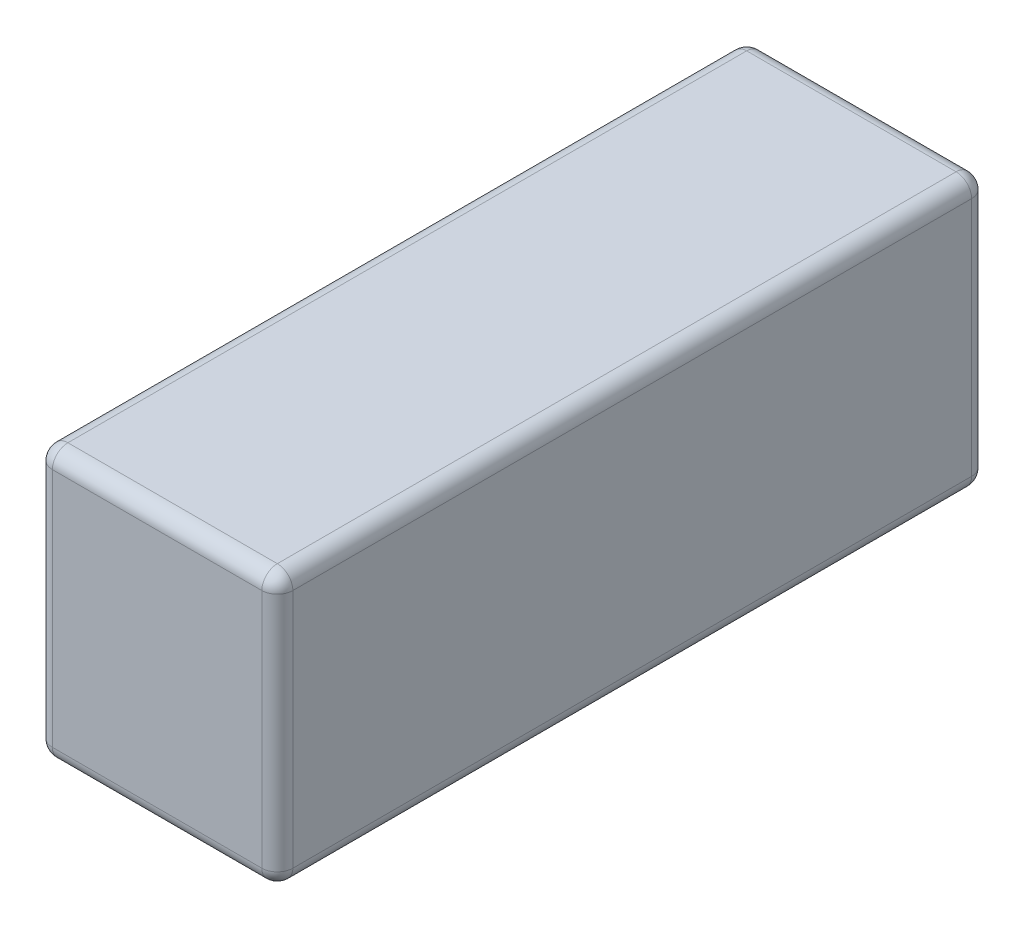
ISO-10303-21;
HEADER;
FILE_DESCRIPTION(('STEP AP214'),'2;1');
FILE_NAME('part.step','',(''),(''),'','','');
FILE_SCHEMA(('AUTOMOTIVE_DESIGN { 1 0 10303 214 1 1 1 1 }'));
ENDSEC;
DATA;
#1=APPLICATION_CONTEXT('core data for automotive mechanical design processes');
#2=APPLICATION_PROTOCOL_DEFINITION('international standard','automotive_design',2000,#1);
#3=PRODUCT_CONTEXT('',#1,'mechanical');
#4=PRODUCT('Part','Part','',(#3));
#5=PRODUCT_RELATED_PRODUCT_CATEGORY('part','',(#4));
#6=PRODUCT_DEFINITION_FORMATION('','',#4);
#7=PRODUCT_DEFINITION_CONTEXT('part definition',#1,'design');
#8=PRODUCT_DEFINITION('design','',#6,#7);
#9=PRODUCT_DEFINITION_SHAPE('','',#8);
#10=(LENGTH_UNIT() NAMED_UNIT(*) SI_UNIT(.MILLI.,.METRE.));
#11=(NAMED_UNIT(*) PLANE_ANGLE_UNIT() SI_UNIT($,.RADIAN.));
#12=(NAMED_UNIT(*) SI_UNIT($,.STERADIAN.) SOLID_ANGLE_UNIT());
#13=UNCERTAINTY_MEASURE_WITH_UNIT(LENGTH_MEASURE(1.E-05),#10,'distance_accuracy_value','');
#14=(GEOMETRIC_REPRESENTATION_CONTEXT(3) GLOBAL_UNCERTAINTY_ASSIGNED_CONTEXT((#13)) GLOBAL_UNIT_ASSIGNED_CONTEXT((#10,
#11,#12)) REPRESENTATION_CONTEXT('',''));
#15=CARTESIAN_POINT('',(0.,0.,0.));
#16=DIRECTION('',(0.,0.,1.));
#17=DIRECTION('',(1.,0.,0.));
#18=AXIS2_PLACEMENT_3D('',#15,#16,#17);
#19=CARTESIAN_POINT('',(15.5,17.5,91.5));
#20=DIRECTION('',(-1.,0.,0.));
#21=DIRECTION('',(0.,-1.,0.));
#22=AXIS2_PLACEMENT_3D('',#19,#20,#21);
#23=PLANE('',#22);
#24=DIRECTION('',(0.,0.,-1.));
#25=VECTOR('',#24,1.);
#26=CARTESIAN_POINT('',(15.5,15.5,91.5));
#27=LINE('',#26,#25);
#28=CARTESIAN_POINT('',(15.5,15.5,2.));
#29=VERTEX_POINT('',#28);
#30=CARTESIAN_POINT('',(15.5,15.5,89.5));
#31=VERTEX_POINT('',#30);
#32=EDGE_CURVE('E209',#29,#31,#27,.F.);
#33=ORIENTED_EDGE('',*,*,#32,.T.);
#34=DIRECTION('',(0.,1.,0.));
#35=VECTOR('',#34,1.);
#36=CARTESIAN_POINT('',(15.5,-17.5,89.5));
#37=LINE('',#36,#35);
#38=CARTESIAN_POINT('',(15.5,-15.5,89.5));
#39=VERTEX_POINT('',#38);
#40=EDGE_CURVE('E218',#31,#39,#37,.F.);
#41=ORIENTED_EDGE('',*,*,#40,.T.);
#42=DIRECTION('',(0.,0.,-1.));
#43=VECTOR('',#42,1.);
#44=CARTESIAN_POINT('',(15.5,-15.5,91.5));
#45=LINE('',#44,#43);
#46=CARTESIAN_POINT('',(15.5,-15.5,2.));
#47=VERTEX_POINT('',#46);
#48=EDGE_CURVE('E215',#39,#47,#45,.T.);
#49=ORIENTED_EDGE('',*,*,#48,.T.);
#50=DIRECTION('',(0.,1.,0.));
#51=VECTOR('',#50,1.);
#52=CARTESIAN_POINT('',(15.5,17.5,2.));
#53=LINE('',#52,#51);
#54=EDGE_CURVE('E212',#47,#29,#53,.T.);
#55=ORIENTED_EDGE('',*,*,#54,.T.);
#56=EDGE_LOOP('',(#33,#41,#49,#55));
#57=FACE_BOUND('',#56,.T.);
#58=ADVANCED_FACE('F39',(#57),#23,.F.);
#59=CARTESIAN_POINT('',(-15.5,17.5,91.5));
#60=DIRECTION('',(0.,-1.,0.));
#61=DIRECTION('',(0.,0.,-1.));
#62=AXIS2_PLACEMENT_3D('',#59,#60,#61);
#63=PLANE('',#62);
#64=DIRECTION('',(0.,0.,-1.));
#65=VECTOR('',#64,1.);
#66=CARTESIAN_POINT('',(-13.5,17.5,91.5));
#67=LINE('',#66,#65);
#68=CARTESIAN_POINT('',(-13.5,17.5,2.));
#69=VERTEX_POINT('',#68);
#70=CARTESIAN_POINT('',(-13.5,17.5,89.5));
#71=VERTEX_POINT('',#70);
#72=EDGE_CURVE('E202',#69,#71,#67,.F.);
#73=ORIENTED_EDGE('',*,*,#72,.T.);
#74=DIRECTION('',(-1.,0.,0.));
#75=VECTOR('',#74,1.);
#76=CARTESIAN_POINT('',(15.5,17.5,89.5));
#77=LINE('',#76,#75);
#78=CARTESIAN_POINT('',(13.5,17.5,89.5));
#79=VERTEX_POINT('',#78);
#80=EDGE_CURVE('E205',#71,#79,#77,.F.);
#81=ORIENTED_EDGE('',*,*,#80,.T.);
#82=DIRECTION('',(0.,0.,-1.));
#83=VECTOR('',#82,1.);
#84=CARTESIAN_POINT('',(13.5,17.5,91.5));
#85=LINE('',#84,#83);
#86=CARTESIAN_POINT('',(13.5,17.5,2.));
#87=VERTEX_POINT('',#86);
#88=EDGE_CURVE('E199',#79,#87,#85,.T.);
#89=ORIENTED_EDGE('',*,*,#88,.T.);
#90=DIRECTION('',(-1.,0.,0.));
#91=VECTOR('',#90,1.);
#92=CARTESIAN_POINT('',(-15.5,17.5,2.));
#93=LINE('',#92,#91);
#94=EDGE_CURVE('E196',#87,#69,#93,.T.);
#95=ORIENTED_EDGE('',*,*,#94,.T.);
#96=EDGE_LOOP('',(#73,#81,#89,#95));
#97=FACE_BOUND('',#96,.T.);
#98=ADVANCED_FACE('F351',(#97),#63,.F.);
#99=CARTESIAN_POINT('',(-15.5,17.5,91.5));
#100=DIRECTION('',(1.,0.,0.));
#101=DIRECTION('',(0.,0.,-1.));
#102=AXIS2_PLACEMENT_3D('',#99,#100,#101);
#103=PLANE('',#102);
#104=DIRECTION('',(0.,0.,-1.));
#105=VECTOR('',#104,1.);
#106=CARTESIAN_POINT('',(-15.5,-15.5,91.5));
#107=LINE('',#106,#105);
#108=CARTESIAN_POINT('',(-15.5,-15.5,2.));
#109=VERTEX_POINT('',#108);
#110=CARTESIAN_POINT('',(-15.5,-15.5,89.5));
#111=VERTEX_POINT('',#110);
#112=EDGE_CURVE('E189',#109,#111,#107,.F.);
#113=ORIENTED_EDGE('',*,*,#112,.T.);
#114=DIRECTION('',(0.,-1.,0.));
#115=VECTOR('',#114,1.);
#116=CARTESIAN_POINT('',(-15.5,17.5,89.5));
#117=LINE('',#116,#115);
#118=CARTESIAN_POINT('',(-15.5,15.5,89.5));
#119=VERTEX_POINT('',#118);
#120=EDGE_CURVE('E192',#111,#119,#117,.F.);
#121=ORIENTED_EDGE('',*,*,#120,.T.);
#122=DIRECTION('',(0.,0.,-1.));
#123=VECTOR('',#122,1.);
#124=CARTESIAN_POINT('',(-15.5,15.5,91.5));
#125=LINE('',#124,#123);
#126=CARTESIAN_POINT('',(-15.5,15.5,2.));
#127=VERTEX_POINT('',#126);
#128=EDGE_CURVE('E186',#119,#127,#125,.T.);
#129=ORIENTED_EDGE('',*,*,#128,.T.);
#130=DIRECTION('',(0.,-1.,0.));
#131=VECTOR('',#130,1.);
#132=CARTESIAN_POINT('',(-15.5,17.5,2.));
#133=LINE('',#132,#131);
#134=EDGE_CURVE('E183',#127,#109,#133,.T.);
#135=ORIENTED_EDGE('',*,*,#134,.T.);
#136=EDGE_LOOP('',(#113,#121,#129,#135));
#137=FACE_BOUND('',#136,.T.);
#138=ADVANCED_FACE('F337',(#137),#103,.F.);
#139=CARTESIAN_POINT('',(-15.5,-17.5,91.5));
#140=DIRECTION('',(0.,1.,0.));
#141=DIRECTION('',(0.,0.,1.));
#142=AXIS2_PLACEMENT_3D('',#139,#140,#141);
#143=PLANE('',#142);
#144=DIRECTION('',(0.,0.,-1.));
#145=VECTOR('',#144,1.);
#146=CARTESIAN_POINT('',(13.5,-17.5,91.5));
#147=LINE('',#146,#145);
#148=CARTESIAN_POINT('',(13.5,-17.5,2.));
#149=VERTEX_POINT('',#148);
#150=CARTESIAN_POINT('',(13.5,-17.5,89.5));
#151=VERTEX_POINT('',#150);
#152=EDGE_CURVE('E167',#149,#151,#147,.F.);
#153=ORIENTED_EDGE('',*,*,#152,.T.);
#154=DIRECTION('',(1.,0.,0.));
#155=VECTOR('',#154,1.);
#156=CARTESIAN_POINT('',(-15.5,-17.5,89.5));
#157=LINE('',#156,#155);
#158=CARTESIAN_POINT('',(-13.5,-17.5,89.5));
#159=VERTEX_POINT('',#158);
#160=EDGE_CURVE('E135',#151,#159,#157,.F.);
#161=ORIENTED_EDGE('',*,*,#160,.T.);
#162=DIRECTION('',(0.,0.,-1.));
#163=VECTOR('',#162,1.);
#164=CARTESIAN_POINT('',(-13.5,-17.5,91.5));
#165=LINE('',#164,#163);
#166=CARTESIAN_POINT('',(-13.5,-17.5,2.));
#167=VERTEX_POINT('',#166);
#168=EDGE_CURVE('E178',#159,#167,#165,.T.);
#169=ORIENTED_EDGE('',*,*,#168,.T.);
#170=DIRECTION('',(1.,0.,0.));
#171=VECTOR('',#170,1.);
#172=CARTESIAN_POINT('',(-15.5,-17.5,2.));
#173=LINE('',#172,#171);
#174=EDGE_CURVE('E171',#167,#149,#173,.T.);
#175=ORIENTED_EDGE('',*,*,#174,.T.);
#176=EDGE_LOOP('',(#153,#161,#169,#175));
#177=FACE_BOUND('',#176,.T.);
#178=ADVANCED_FACE('F372',(#177),#143,.F.);
#179=CARTESIAN_POINT('',(0.,0.,91.5));
#180=DIRECTION('',(0.,0.,1.));
#181=DIRECTION('',(1.,0.,0.));
#182=AXIS2_PLACEMENT_3D('',#179,#180,#181);
#183=PLANE('',#182);
#184=DIRECTION('',(0.,-1.,0.));
#185=VECTOR('',#184,1.);
#186=CARTESIAN_POINT('',(-13.5,-17.5,91.5));
#187=LINE('',#186,#185);
#188=CARTESIAN_POINT('',(-13.5,15.5,91.5));
#189=VERTEX_POINT('',#188);
#190=CARTESIAN_POINT('',(-13.5,-15.5,91.5));
#191=VERTEX_POINT('',#190);
#192=EDGE_CURVE('E164',#189,#191,#187,.T.);
#193=ORIENTED_EDGE('',*,*,#192,.T.);
#194=DIRECTION('',(1.,0.,0.));
#195=VECTOR('',#194,1.);
#196=CARTESIAN_POINT('',(15.5,-15.5,91.5));
#197=LINE('',#196,#195);
#198=CARTESIAN_POINT('',(13.5,-15.5,91.5));
#199=VERTEX_POINT('',#198);
#200=EDGE_CURVE('E133',#191,#199,#197,.T.);
#201=ORIENTED_EDGE('',*,*,#200,.T.);
#202=DIRECTION('',(0.,1.,0.));
#203=VECTOR('',#202,1.);
#204=CARTESIAN_POINT('',(13.5,17.5,91.5));
#205=LINE('',#204,#203);
#206=CARTESIAN_POINT('',(13.5,15.5,91.5));
#207=VERTEX_POINT('',#206);
#208=EDGE_CURVE('E153',#199,#207,#205,.T.);
#209=ORIENTED_EDGE('',*,*,#208,.T.);
#210=DIRECTION('',(-1.,0.,0.));
#211=VECTOR('',#210,1.);
#212=CARTESIAN_POINT('',(-15.5,15.5,91.5));
#213=LINE('',#212,#211);
#214=EDGE_CURVE('E160',#207,#189,#213,.T.);
#215=ORIENTED_EDGE('',*,*,#214,.T.);
#216=EDGE_LOOP('',(#193,#201,#209,#215));
#217=FACE_BOUND('',#216,.T.);
#218=ADVANCED_FACE('F162',(#217),#183,.T.);
#219=CARTESIAN_POINT('',(0.,0.,0.));
#220=DIRECTION('',(0.,0.,1.));
#221=DIRECTION('',(1.,0.,0.));
#222=AXIS2_PLACEMENT_3D('',#219,#220,#221);
#223=PLANE('',#222);
#224=DIRECTION('',(1.,0.,0.));
#225=VECTOR('',#224,1.);
#226=CARTESIAN_POINT('',(0.,-15.5,0.));
#227=LINE('',#226,#225);
#228=CARTESIAN_POINT('',(13.5,-15.5,0.));
#229=VERTEX_POINT('',#228);
#230=CARTESIAN_POINT('',(-13.5,-15.5,0.));
#231=VERTEX_POINT('',#230);
#232=EDGE_CURVE('E49',#229,#231,#227,.F.);
#233=ORIENTED_EDGE('',*,*,#232,.T.);
#234=DIRECTION('',(0.,-1.,0.));
#235=VECTOR('',#234,1.);
#236=CARTESIAN_POINT('',(-13.5,0.,0.));
#237=LINE('',#236,#235);
#238=CARTESIAN_POINT('',(-13.5,15.5,0.));
#239=VERTEX_POINT('',#238);
#240=EDGE_CURVE('E11',#231,#239,#237,.F.);
#241=ORIENTED_EDGE('',*,*,#240,.T.);
#242=DIRECTION('',(-1.,0.,0.));
#243=VECTOR('',#242,1.);
#244=CARTESIAN_POINT('',(0.,15.5,0.));
#245=LINE('',#244,#243);
#246=CARTESIAN_POINT('',(13.5,15.5,0.));
#247=VERTEX_POINT('',#246);
#248=EDGE_CURVE('E222',#239,#247,#245,.F.);
#249=ORIENTED_EDGE('',*,*,#248,.T.);
#250=DIRECTION('',(0.,1.,0.));
#251=VECTOR('',#250,1.);
#252=CARTESIAN_POINT('',(13.5,0.,0.));
#253=LINE('',#252,#251);
#254=EDGE_CURVE('E60',#247,#229,#253,.F.);
#255=ORIENTED_EDGE('',*,*,#254,.T.);
#256=EDGE_LOOP('',(#233,#241,#249,#255));
#257=FACE_BOUND('',#256,.T.);
#258=ADVANCED_FACE('F317',(#257),#223,.F.);
#259=CARTESIAN_POINT('',(-15.5,15.5,2.));
#260=DIRECTION('',(-1.,0.,0.));
#261=DIRECTION('',(0.,0.,1.));
#262=AXIS2_PLACEMENT_3D('',#259,#260,#261);
#263=CYLINDRICAL_SURFACE('',#262,2.);
#264=CARTESIAN_POINT('',(-13.5,15.5,2.));
#265=DIRECTION('',(-1.,0.,0.));
#266=DIRECTION('',(0.,0.,1.));
#267=AXIS2_PLACEMENT_3D('',#264,#265,#266);
#268=CIRCLE('',#267,2.);
#269=EDGE_CURVE('E43',#69,#239,#268,.T.);
#270=ORIENTED_EDGE('',*,*,#269,.F.);
#271=ORIENTED_EDGE('',*,*,#94,.F.);
#272=CARTESIAN_POINT('',(13.5,15.5,2.));
#273=DIRECTION('',(1.,0.,0.));
#274=DIRECTION('',(0.,1.,0.));
#275=AXIS2_PLACEMENT_3D('',#272,#273,#274);
#276=CIRCLE('',#275,2.);
#277=EDGE_CURVE('E298',#247,#87,#276,.T.);
#278=ORIENTED_EDGE('',*,*,#277,.F.);
#279=ORIENTED_EDGE('',*,*,#248,.F.);
#280=EDGE_LOOP('',(#270,#271,#278,#279));
#281=FACE_BOUND('',#280,.T.);
#282=ADVANCED_FACE('F41',(#281),#263,.T.);
#283=CARTESIAN_POINT('',(-13.5,15.5,2.));
#284=DIRECTION('',(0.,0.,1.));
#285=DIRECTION('',(1.,0.,0.));
#286=AXIS2_PLACEMENT_3D('',#283,#284,#285);
#287=SPHERICAL_SURFACE('',#286,2.);
#288=CARTESIAN_POINT('',(-13.5,15.5,2.));
#289=DIRECTION('',(0.,0.,-1.));
#290=DIRECTION('',(-1.,0.,0.));
#291=AXIS2_PLACEMENT_3D('',#288,#289,#290);
#292=CIRCLE('',#291,2.);
#293=EDGE_CURVE('E292',#69,#127,#292,.F.);
#294=ORIENTED_EDGE('',*,*,#293,.F.);
#295=ORIENTED_EDGE('',*,*,#269,.T.);
#296=CARTESIAN_POINT('',(-13.5,15.5,2.));
#297=DIRECTION('',(0.,1.,0.));
#298=DIRECTION('',(0.,0.,1.));
#299=AXIS2_PLACEMENT_3D('',#296,#297,#298);
#300=CIRCLE('',#299,2.);
#301=EDGE_CURVE('E296',#127,#239,#300,.F.);
#302=ORIENTED_EDGE('',*,*,#301,.F.);
#303=EDGE_LOOP('',(#294,#295,#302));
#304=FACE_BOUND('',#303,.T.);
#305=ADVANCED_FACE('F312',(#304),#287,.T.);
#306=CARTESIAN_POINT('',(13.5,15.5,2.));
#307=DIRECTION('',(0.,0.,1.));
#308=DIRECTION('',(1.,0.,0.));
#309=AXIS2_PLACEMENT_3D('',#306,#307,#308);
#310=SPHERICAL_SURFACE('',#309,2.);
#311=CARTESIAN_POINT('',(13.5,15.5,2.));
#312=DIRECTION('',(0.,1.,0.));
#313=DIRECTION('',(0.,0.,1.));
#314=AXIS2_PLACEMENT_3D('',#311,#312,#313);
#315=CIRCLE('',#314,2.);
#316=EDGE_CURVE('E284',#247,#29,#315,.F.);
#317=ORIENTED_EDGE('',*,*,#316,.F.);
#318=ORIENTED_EDGE('',*,*,#277,.T.);
#319=CARTESIAN_POINT('',(13.5,15.5,2.));
#320=DIRECTION('',(0.,0.,-1.));
#321=DIRECTION('',(-1.,0.,0.));
#322=AXIS2_PLACEMENT_3D('',#319,#320,#321);
#323=CIRCLE('',#322,2.);
#324=EDGE_CURVE('E288',#29,#87,#323,.F.);
#325=ORIENTED_EDGE('',*,*,#324,.F.);
#326=EDGE_LOOP('',(#317,#318,#325));
#327=FACE_BOUND('',#326,.T.);
#328=ADVANCED_FACE('F361',(#327),#310,.T.);
#329=CARTESIAN_POINT('',(-13.5,17.5,2.));
#330=DIRECTION('',(0.,-1.,0.));
#331=DIRECTION('',(0.,0.,-1.));
#332=AXIS2_PLACEMENT_3D('',#329,#330,#331);
#333=CYLINDRICAL_SURFACE('',#332,2.);
#334=ORIENTED_EDGE('',*,*,#301,.T.);
#335=ORIENTED_EDGE('',*,*,#240,.F.);
#336=CARTESIAN_POINT('',(-13.5,-15.5,2.));
#337=DIRECTION('',(0.,-1.,0.));
#338=DIRECTION('',(0.,0.,-1.));
#339=AXIS2_PLACEMENT_3D('',#336,#337,#338);
#340=CIRCLE('',#339,2.);
#341=EDGE_CURVE('E276',#109,#231,#340,.T.);
#342=ORIENTED_EDGE('',*,*,#341,.F.);
#343=ORIENTED_EDGE('',*,*,#134,.F.);
#344=EDGE_LOOP('',(#334,#335,#342,#343));
#345=FACE_BOUND('',#344,.T.);
#346=ADVANCED_FACE('F321',(#345),#333,.T.);
#347=CARTESIAN_POINT('',(-13.5,15.5,91.5));
#348=DIRECTION('',(0.,0.,-1.));
#349=DIRECTION('',(-1.,0.,0.));
#350=AXIS2_PLACEMENT_3D('',#347,#348,#349);
#351=CYLINDRICAL_SURFACE('',#350,2.);
#352=ORIENTED_EDGE('',*,*,#293,.T.);
#353=ORIENTED_EDGE('',*,*,#128,.F.);
#354=CARTESIAN_POINT('',(-13.5,15.5,89.5));
#355=DIRECTION('',(0.,0.,1.));
#356=DIRECTION('',(1.,0.,0.));
#357=AXIS2_PLACEMENT_3D('',#354,#355,#356);
#358=CIRCLE('',#357,2.);
#359=EDGE_CURVE('E272',#71,#119,#358,.T.);
#360=ORIENTED_EDGE('',*,*,#359,.F.);
#361=ORIENTED_EDGE('',*,*,#72,.F.);
#362=EDGE_LOOP('',(#352,#353,#360,#361));
#363=FACE_BOUND('',#362,.T.);
#364=ADVANCED_FACE('F348',(#363),#351,.T.);
#365=CARTESIAN_POINT('',(0.,15.5,89.5));
#366=DIRECTION('',(1.,0.,0.));
#367=DIRECTION('',(0.,0.,-1.));
#368=AXIS2_PLACEMENT_3D('',#365,#366,#367);
#369=CYLINDRICAL_SURFACE('',#368,2.);
#370=CARTESIAN_POINT('',(13.5,15.5,89.5));
#371=DIRECTION('',(1.,0.,0.));
#372=DIRECTION('',(0.,0.,-1.));
#373=AXIS2_PLACEMENT_3D('',#370,#371,#372);
#374=CIRCLE('',#373,2.);
#375=EDGE_CURVE('E264',#79,#207,#374,.T.);
#376=ORIENTED_EDGE('',*,*,#375,.F.);
#377=ORIENTED_EDGE('',*,*,#80,.F.);
#378=CARTESIAN_POINT('',(-13.5,15.5,89.5));
#379=DIRECTION('',(-1.,0.,0.));
#380=DIRECTION('',(0.,0.,1.));
#381=AXIS2_PLACEMENT_3D('',#378,#379,#380);
#382=CIRCLE('',#381,2.);
#383=EDGE_CURVE('E268',#189,#71,#382,.T.);
#384=ORIENTED_EDGE('',*,*,#383,.F.);
#385=ORIENTED_EDGE('',*,*,#214,.F.);
#386=EDGE_LOOP('',(#376,#377,#384,#385));
#387=FACE_BOUND('',#386,.T.);
#388=ADVANCED_FACE('F354',(#387),#369,.T.);
#389=CARTESIAN_POINT('',(13.5,15.5,91.5));
#390=DIRECTION('',(0.,0.,-1.));
#391=DIRECTION('',(-1.,0.,0.));
#392=AXIS2_PLACEMENT_3D('',#389,#390,#391);
#393=CYLINDRICAL_SURFACE('',#392,2.);
#394=ORIENTED_EDGE('',*,*,#324,.T.);
#395=ORIENTED_EDGE('',*,*,#88,.F.);
#396=CARTESIAN_POINT('',(13.5,15.5,89.5));
#397=DIRECTION('',(0.,0.,1.));
#398=DIRECTION('',(1.,0.,0.));
#399=AXIS2_PLACEMENT_3D('',#396,#397,#398);
#400=CIRCLE('',#399,2.);
#401=EDGE_CURVE('E261',#31,#79,#400,.T.);
#402=ORIENTED_EDGE('',*,*,#401,.F.);
#403=ORIENTED_EDGE('',*,*,#32,.F.);
#404=EDGE_LOOP('',(#394,#395,#402,#403));
#405=FACE_BOUND('',#404,.T.);
#406=ADVANCED_FACE('F359',(#405),#393,.T.);
#407=CARTESIAN_POINT('',(13.5,17.5,2.));
#408=DIRECTION('',(0.,1.,0.));
#409=DIRECTION('',(-1.,0.,0.));
#410=AXIS2_PLACEMENT_3D('',#407,#408,#409);
#411=CYLINDRICAL_SURFACE('',#410,2.);
#412=ORIENTED_EDGE('',*,*,#316,.T.);
#413=ORIENTED_EDGE('',*,*,#54,.F.);
#414=CARTESIAN_POINT('',(13.5,-15.5,2.));
#415=DIRECTION('',(0.,-1.,0.));
#416=DIRECTION('',(1.,0.,0.));
#417=AXIS2_PLACEMENT_3D('',#414,#415,#416);
#418=CIRCLE('',#417,2.);
#419=EDGE_CURVE('E257',#229,#47,#418,.T.);
#420=ORIENTED_EDGE('',*,*,#419,.F.);
#421=ORIENTED_EDGE('',*,*,#254,.F.);
#422=EDGE_LOOP('',(#412,#413,#420,#421));
#423=FACE_BOUND('',#422,.T.);
#424=ADVANCED_FACE('F364',(#423),#411,.T.);
#425=CARTESIAN_POINT('',(-15.5,-15.5,2.));
#426=DIRECTION('',(1.,0.,0.));
#427=DIRECTION('',(0.,0.,-1.));
#428=AXIS2_PLACEMENT_3D('',#425,#426,#427);
#429=CYLINDRICAL_SURFACE('',#428,2.);
#430=CARTESIAN_POINT('',(-13.5,-15.5,2.));
#431=DIRECTION('',(-1.,0.,0.));
#432=DIRECTION('',(0.,0.,1.));
#433=AXIS2_PLACEMENT_3D('',#430,#431,#432);
#434=CIRCLE('',#433,2.);
#435=EDGE_CURVE('E280',#231,#167,#434,.T.);
#436=ORIENTED_EDGE('',*,*,#435,.F.);
#437=ORIENTED_EDGE('',*,*,#232,.F.);
#438=CARTESIAN_POINT('',(13.5,-15.5,2.));
#439=DIRECTION('',(1.,0.,0.));
#440=DIRECTION('',(0.,0.,-1.));
#441=AXIS2_PLACEMENT_3D('',#438,#439,#440);
#442=CIRCLE('',#441,2.);
#443=EDGE_CURVE('E253',#149,#229,#442,.T.);
#444=ORIENTED_EDGE('',*,*,#443,.F.);
#445=ORIENTED_EDGE('',*,*,#174,.F.);
#446=EDGE_LOOP('',(#436,#437,#444,#445));
#447=FACE_BOUND('',#446,.T.);
#448=ADVANCED_FACE('F325',(#447),#429,.T.);
#449=CARTESIAN_POINT('',(-13.5,-15.5,2.));
#450=DIRECTION('',(0.,0.,1.));
#451=DIRECTION('',(1.,0.,0.));
#452=AXIS2_PLACEMENT_3D('',#449,#450,#451);
#453=SPHERICAL_SURFACE('',#452,2.);
#454=ORIENTED_EDGE('',*,*,#341,.T.);
#455=ORIENTED_EDGE('',*,*,#435,.T.);
#456=CARTESIAN_POINT('',(-13.5,-15.5,2.));
#457=DIRECTION('',(0.,0.,-1.));
#458=DIRECTION('',(-1.,0.,0.));
#459=AXIS2_PLACEMENT_3D('',#456,#457,#458);
#460=CIRCLE('',#459,2.);
#461=EDGE_CURVE('E249',#109,#167,#460,.F.);
#462=ORIENTED_EDGE('',*,*,#461,.F.);
#463=EDGE_LOOP('',(#454,#455,#462));
#464=FACE_BOUND('',#463,.T.);
#465=ADVANCED_FACE('F329',(#464),#453,.T.);
#466=CARTESIAN_POINT('',(-13.5,15.5,89.5));
#467=DIRECTION('',(0.,0.,1.));
#468=DIRECTION('',(1.,0.,0.));
#469=AXIS2_PLACEMENT_3D('',#466,#467,#468);
#470=SPHERICAL_SURFACE('',#469,2.);
#471=ORIENTED_EDGE('',*,*,#383,.T.);
#472=ORIENTED_EDGE('',*,*,#359,.T.);
#473=CARTESIAN_POINT('',(-13.5,15.5,89.5));
#474=DIRECTION('',(0.,1.,0.));
#475=DIRECTION('',(0.,0.,1.));
#476=AXIS2_PLACEMENT_3D('',#473,#474,#475);
#477=CIRCLE('',#476,2.);
#478=EDGE_CURVE('E246',#189,#119,#477,.F.);
#479=ORIENTED_EDGE('',*,*,#478,.F.);
#480=EDGE_LOOP('',(#471,#472,#479));
#481=FACE_BOUND('',#480,.T.);
#482=ADVANCED_FACE('F345',(#481),#470,.T.);
#483=CARTESIAN_POINT('',(13.5,15.5,89.5));
#484=DIRECTION('',(0.,0.,1.));
#485=DIRECTION('',(1.,0.,0.));
#486=AXIS2_PLACEMENT_3D('',#483,#484,#485);
#487=SPHERICAL_SURFACE('',#486,2.);
#488=ORIENTED_EDGE('',*,*,#401,.T.);
#489=ORIENTED_EDGE('',*,*,#375,.T.);
#490=CARTESIAN_POINT('',(13.5,15.5,89.5));
#491=DIRECTION('',(0.,1.,0.));
#492=DIRECTION('',(0.,0.,1.));
#493=AXIS2_PLACEMENT_3D('',#490,#491,#492);
#494=CIRCLE('',#493,2.);
#495=EDGE_CURVE('E156',#31,#207,#494,.F.);
#496=ORIENTED_EDGE('',*,*,#495,.F.);
#497=EDGE_LOOP('',(#488,#489,#496));
#498=FACE_BOUND('',#497,.T.);
#499=ADVANCED_FACE('F408',(#498),#487,.T.);
#500=CARTESIAN_POINT('',(13.5,-15.5,2.));
#501=DIRECTION('',(0.,0.,1.));
#502=DIRECTION('',(1.,0.,0.));
#503=AXIS2_PLACEMENT_3D('',#500,#501,#502);
#504=SPHERICAL_SURFACE('',#503,2.);
#505=ORIENTED_EDGE('',*,*,#443,.T.);
#506=ORIENTED_EDGE('',*,*,#419,.T.);
#507=CARTESIAN_POINT('',(13.5,-15.5,2.));
#508=DIRECTION('',(0.,0.,-1.));
#509=DIRECTION('',(-1.,0.,0.));
#510=AXIS2_PLACEMENT_3D('',#507,#508,#509);
#511=CIRCLE('',#510,2.);
#512=EDGE_CURVE('E240',#149,#47,#511,.F.);
#513=ORIENTED_EDGE('',*,*,#512,.F.);
#514=EDGE_LOOP('',(#505,#506,#513));
#515=FACE_BOUND('',#514,.T.);
#516=ADVANCED_FACE('F367',(#515),#504,.T.);
#517=CARTESIAN_POINT('',(-13.5,-15.5,91.5));
#518=DIRECTION('',(0.,0.,-1.));
#519=DIRECTION('',(-1.,0.,0.));
#520=AXIS2_PLACEMENT_3D('',#517,#518,#519);
#521=CYLINDRICAL_SURFACE('',#520,2.);
#522=ORIENTED_EDGE('',*,*,#461,.T.);
#523=ORIENTED_EDGE('',*,*,#168,.F.);
#524=CARTESIAN_POINT('',(-13.5,-15.5,89.5));
#525=DIRECTION('',(0.,0.,1.));
#526=DIRECTION('',(1.,0.,0.));
#527=AXIS2_PLACEMENT_3D('',#524,#525,#526);
#528=CIRCLE('',#527,2.);
#529=EDGE_CURVE('E236',#111,#159,#528,.T.);
#530=ORIENTED_EDGE('',*,*,#529,.F.);
#531=ORIENTED_EDGE('',*,*,#112,.F.);
#532=EDGE_LOOP('',(#522,#523,#530,#531));
#533=FACE_BOUND('',#532,.T.);
#534=ADVANCED_FACE('F334',(#533),#521,.T.);
#535=CARTESIAN_POINT('',(-13.5,0.,89.5));
#536=DIRECTION('',(0.,1.,0.));
#537=DIRECTION('',(0.,0.,1.));
#538=AXIS2_PLACEMENT_3D('',#535,#536,#537);
#539=CYLINDRICAL_SURFACE('',#538,2.);
#540=ORIENTED_EDGE('',*,*,#478,.T.);
#541=ORIENTED_EDGE('',*,*,#120,.F.);
#542=CARTESIAN_POINT('',(-13.5,-15.5,89.5));
#543=DIRECTION('',(0.,-1.,0.));
#544=DIRECTION('',(0.,0.,-1.));
#545=AXIS2_PLACEMENT_3D('',#542,#543,#544);
#546=CIRCLE('',#545,2.);
#547=EDGE_CURVE('E150',#191,#111,#546,.T.);
#548=ORIENTED_EDGE('',*,*,#547,.F.);
#549=ORIENTED_EDGE('',*,*,#192,.F.);
#550=EDGE_LOOP('',(#540,#541,#548,#549));
#551=FACE_BOUND('',#550,.T.);
#552=ADVANCED_FACE('F339',(#551),#539,.T.);
#553=CARTESIAN_POINT('',(13.5,0.,89.5));
#554=DIRECTION('',(0.,-1.,0.));
#555=DIRECTION('',(1.,0.,0.));
#556=AXIS2_PLACEMENT_3D('',#553,#554,#555);
#557=CYLINDRICAL_SURFACE('',#556,2.);
#558=ORIENTED_EDGE('',*,*,#495,.T.);
#559=ORIENTED_EDGE('',*,*,#208,.F.);
#560=CARTESIAN_POINT('',(13.5,-15.5,89.5));
#561=DIRECTION('',(0.,-1.,0.));
#562=DIRECTION('',(0.,0.,-1.));
#563=AXIS2_PLACEMENT_3D('',#560,#561,#562);
#564=CIRCLE('',#563,2.);
#565=EDGE_CURVE('E141',#39,#199,#564,.T.);
#566=ORIENTED_EDGE('',*,*,#565,.F.);
#567=ORIENTED_EDGE('',*,*,#40,.F.);
#568=EDGE_LOOP('',(#558,#559,#566,#567));
#569=FACE_BOUND('',#568,.T.);
#570=ADVANCED_FACE('F154',(#569),#557,.T.);
#571=CARTESIAN_POINT('',(13.5,-15.5,91.5));
#572=DIRECTION('',(0.,0.,-1.));
#573=DIRECTION('',(-1.,0.,0.));
#574=AXIS2_PLACEMENT_3D('',#571,#572,#573);
#575=CYLINDRICAL_SURFACE('',#574,2.);
#576=ORIENTED_EDGE('',*,*,#512,.T.);
#577=ORIENTED_EDGE('',*,*,#48,.F.);
#578=CARTESIAN_POINT('',(13.5,-15.5,89.5));
#579=DIRECTION('',(0.,0.,1.));
#580=DIRECTION('',(1.,0.,0.));
#581=AXIS2_PLACEMENT_3D('',#578,#579,#580);
#582=CIRCLE('',#581,2.);
#583=EDGE_CURVE('E145',#151,#39,#582,.T.);
#584=ORIENTED_EDGE('',*,*,#583,.F.);
#585=ORIENTED_EDGE('',*,*,#152,.F.);
#586=EDGE_LOOP('',(#576,#577,#584,#585));
#587=FACE_BOUND('',#586,.T.);
#588=ADVANCED_FACE('F370',(#587),#575,.T.);
#589=CARTESIAN_POINT('',(-13.5,-15.5,89.5));
#590=DIRECTION('',(0.,0.,1.));
#591=DIRECTION('',(1.,0.,0.));
#592=AXIS2_PLACEMENT_3D('',#589,#590,#591);
#593=SPHERICAL_SURFACE('',#592,2.);
#594=ORIENTED_EDGE('',*,*,#547,.T.);
#595=ORIENTED_EDGE('',*,*,#529,.T.);
#596=CARTESIAN_POINT('',(-13.5,-15.5,89.5));
#597=DIRECTION('',(-1.,0.,0.));
#598=DIRECTION('',(0.,0.,1.));
#599=AXIS2_PLACEMENT_3D('',#596,#597,#598);
#600=CIRCLE('',#599,2.);
#601=EDGE_CURVE('E138',#191,#159,#600,.F.);
#602=ORIENTED_EDGE('',*,*,#601,.F.);
#603=EDGE_LOOP('',(#594,#595,#602));
#604=FACE_BOUND('',#603,.T.);
#605=ADVANCED_FACE('F394',(#604),#593,.T.);
#606=CARTESIAN_POINT('',(13.5,-15.5,89.5));
#607=DIRECTION('',(0.,0.,1.));
#608=DIRECTION('',(1.,0.,0.));
#609=AXIS2_PLACEMENT_3D('',#606,#607,#608);
#610=SPHERICAL_SURFACE('',#609,2.);
#611=ORIENTED_EDGE('',*,*,#583,.T.);
#612=ORIENTED_EDGE('',*,*,#565,.T.);
#613=CARTESIAN_POINT('',(13.5,-15.5,89.5));
#614=DIRECTION('',(1.,0.,0.));
#615=DIRECTION('',(0.,0.,-1.));
#616=AXIS2_PLACEMENT_3D('',#613,#614,#615);
#617=CIRCLE('',#616,2.);
#618=EDGE_CURVE('E129',#151,#199,#617,.F.);
#619=ORIENTED_EDGE('',*,*,#618,.F.);
#620=EDGE_LOOP('',(#611,#612,#619));
#621=FACE_BOUND('',#620,.T.);
#622=ADVANCED_FACE('F143',(#621),#610,.T.);
#623=CARTESIAN_POINT('',(0.,-15.5,89.5));
#624=DIRECTION('',(-1.,0.,0.));
#625=DIRECTION('',(0.,0.,1.));
#626=AXIS2_PLACEMENT_3D('',#623,#624,#625);
#627=CYLINDRICAL_SURFACE('',#626,2.);
#628=ORIENTED_EDGE('',*,*,#601,.T.);
#629=ORIENTED_EDGE('',*,*,#160,.F.);
#630=ORIENTED_EDGE('',*,*,#618,.T.);
#631=ORIENTED_EDGE('',*,*,#200,.F.);
#632=EDGE_LOOP('',(#628,#629,#630,#631));
#633=FACE_BOUND('',#632,.T.);
#634=ADVANCED_FACE('F131',(#633),#627,.T.);
#635=CLOSED_SHELL('',(#58,#98,#138,#178,#218,#258,#282,#305,#328,#346,#364,#388,#406,#424,#448,
#465,#482,#499,#516,#534,#552,#570,#588,#605,#622,#634));
#636=MANIFOLD_SOLID_BREP('B2',#635);
#637=ADVANCED_BREP_SHAPE_REPRESENTATION('',(#18,#636),#14);
#638=SHAPE_DEFINITION_REPRESENTATION(#9,#637);
ENDSEC;
END-ISO-10303-21;
